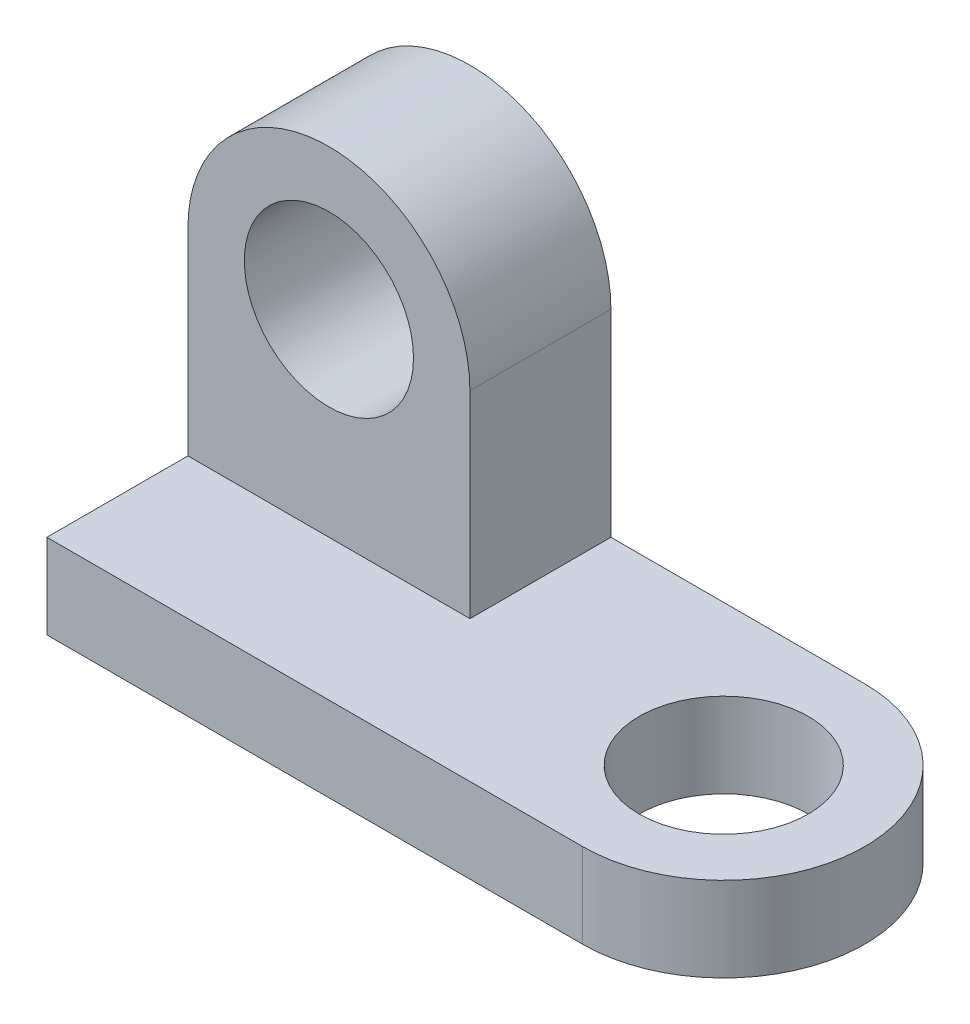
ISO-10303-21;
HEADER;
FILE_DESCRIPTION(('STEP AP214'),'2;1');
FILE_NAME('part.step','',(''),(''),'','','');
FILE_SCHEMA(('AUTOMOTIVE_DESIGN { 1 0 10303 214 1 1 1 1 }'));
ENDSEC;
DATA;
#1=APPLICATION_CONTEXT('core data for automotive mechanical design processes');
#2=APPLICATION_PROTOCOL_DEFINITION('international standard','automotive_design',2000,#1);
#3=PRODUCT_CONTEXT('',#1,'mechanical');
#4=PRODUCT('Part','Part','',(#3));
#5=PRODUCT_RELATED_PRODUCT_CATEGORY('part','',(#4));
#6=PRODUCT_DEFINITION_FORMATION('','',#4);
#7=PRODUCT_DEFINITION_CONTEXT('part definition',#1,'design');
#8=PRODUCT_DEFINITION('design','',#6,#7);
#9=PRODUCT_DEFINITION_SHAPE('','',#8);
#10=(LENGTH_UNIT() NAMED_UNIT(*) SI_UNIT(.MILLI.,.METRE.));
#11=(NAMED_UNIT(*) PLANE_ANGLE_UNIT() SI_UNIT($,.RADIAN.));
#12=(NAMED_UNIT(*) SI_UNIT($,.STERADIAN.) SOLID_ANGLE_UNIT());
#13=UNCERTAINTY_MEASURE_WITH_UNIT(LENGTH_MEASURE(1.E-05),#10,'distance_accuracy_value','');
#14=(GEOMETRIC_REPRESENTATION_CONTEXT(3) GLOBAL_UNCERTAINTY_ASSIGNED_CONTEXT((#13)) GLOBAL_UNIT_ASSIGNED_CONTEXT((#10,
#11,#12)) REPRESENTATION_CONTEXT('',''));
#15=CARTESIAN_POINT('',(0.,0.,0.));
#16=DIRECTION('',(0.,0.,1.));
#17=DIRECTION('',(1.,0.,0.));
#18=AXIS2_PLACEMENT_3D('',#15,#16,#17);
#19=CARTESIAN_POINT('',(35.,0.,0.));
#20=DIRECTION('',(0.,-1.,0.));
#21=DIRECTION('',(0.,0.,-1.));
#22=AXIS2_PLACEMENT_3D('',#19,#20,#21);
#23=CYLINDRICAL_SURFACE('',#22,25.);
#24=DIRECTION('',(0.,-1.,0.));
#25=VECTOR('',#24,1.);
#26=CARTESIAN_POINT('',(35.,15.,25.));
#27=LINE('',#26,#25);
#28=CARTESIAN_POINT('',(35.,0.,25.));
#29=VERTEX_POINT('',#28);
#30=CARTESIAN_POINT('',(35.,15.,25.));
#31=VERTEX_POINT('',#30);
#32=EDGE_CURVE('E140',#29,#31,#27,.F.);
#33=ORIENTED_EDGE('',*,*,#32,.F.);
#34=CARTESIAN_POINT('',(35.,0.,0.));
#35=DIRECTION('',(0.,1.,0.));
#36=DIRECTION('',(0.,0.,1.));
#37=AXIS2_PLACEMENT_3D('',#34,#35,#36);
#38=CIRCLE('',#37,25.);
#39=CARTESIAN_POINT('',(35.,0.,-25.));
#40=VERTEX_POINT('',#39);
#41=EDGE_CURVE('E40',#40,#29,#38,.F.);
#42=ORIENTED_EDGE('',*,*,#41,.F.);
#43=DIRECTION('',(0.,-1.,0.));
#44=VECTOR('',#43,1.);
#45=CARTESIAN_POINT('',(35.,15.,-25.));
#46=LINE('',#45,#44);
#47=CARTESIAN_POINT('',(35.,15.,-25.));
#48=VERTEX_POINT('',#47);
#49=EDGE_CURVE('E143',#48,#40,#46,.T.);
#50=ORIENTED_EDGE('',*,*,#49,.F.);
#51=CARTESIAN_POINT('',(35.,15.,0.));
#52=DIRECTION('',(0.,1.,0.));
#53=DIRECTION('',(0.,0.,1.));
#54=AXIS2_PLACEMENT_3D('',#51,#52,#53);
#55=CIRCLE('',#54,25.);
#56=EDGE_CURVE('E11',#31,#48,#55,.T.);
#57=ORIENTED_EDGE('',*,*,#56,.F.);
#58=EDGE_LOOP('',(#33,#42,#50,#57));
#59=FACE_BOUND('',#58,.T.);
#60=ADVANCED_FACE('F33',(#59),#23,.T.);
#61=CARTESIAN_POINT('',(-35.,50.,0.));
#62=DIRECTION('',(0.,0.,1.));
#63=DIRECTION('',(1.,0.,0.));
#64=AXIS2_PLACEMENT_3D('',#61,#62,#63);
#65=CYLINDRICAL_SURFACE('',#64,25.);
#66=DIRECTION('',(0.,0.,-1.));
#67=VECTOR('',#66,1.);
#68=CARTESIAN_POINT('',(-60.,50.,0.));
#69=LINE('',#68,#67);
#70=CARTESIAN_POINT('',(-60.,50.,0.));
#71=VERTEX_POINT('',#70);
#72=CARTESIAN_POINT('',(-60.,50.,-25.));
#73=VERTEX_POINT('',#72);
#74=EDGE_CURVE('E130',#71,#73,#69,.T.);
#75=ORIENTED_EDGE('',*,*,#74,.F.);
#76=CARTESIAN_POINT('',(-35.,50.,0.));
#77=DIRECTION('',(0.,0.,-1.));
#78=DIRECTION('',(-1.,0.,0.));
#79=AXIS2_PLACEMENT_3D('',#76,#77,#78);
#80=CIRCLE('',#79,25.);
#81=CARTESIAN_POINT('',(-9.99999999999999,50.,0.));
#82=VERTEX_POINT('',#81);
#83=EDGE_CURVE('E136',#82,#71,#80,.F.);
#84=ORIENTED_EDGE('',*,*,#83,.F.);
#85=DIRECTION('',(0.,0.,-1.));
#86=VECTOR('',#85,1.);
#87=CARTESIAN_POINT('',(-9.99999999999999,50.,0.));
#88=LINE('',#87,#86);
#89=CARTESIAN_POINT('',(-9.99999999999999,50.,-25.));
#90=VERTEX_POINT('',#89);
#91=EDGE_CURVE('E95',#90,#82,#88,.F.);
#92=ORIENTED_EDGE('',*,*,#91,.F.);
#93=CARTESIAN_POINT('',(-35.,50.,-25.));
#94=DIRECTION('',(0.,0.,1.));
#95=DIRECTION('',(1.,0.,0.));
#96=AXIS2_PLACEMENT_3D('',#93,#94,#95);
#97=CIRCLE('',#96,25.);
#98=EDGE_CURVE('E138',#73,#90,#97,.F.);
#99=ORIENTED_EDGE('',*,*,#98,.F.);
#100=EDGE_LOOP('',(#75,#84,#92,#99));
#101=FACE_BOUND('',#100,.T.);
#102=ADVANCED_FACE('F176',(#101),#65,.T.);
#103=CARTESIAN_POINT('',(-60.,15.,-25.));
#104=DIRECTION('',(0.,0.,1.));
#105=DIRECTION('',(1.,0.,0.));
#106=AXIS2_PLACEMENT_3D('',#103,#104,#105);
#107=PLANE('',#106);
#108=CARTESIAN_POINT('',(-35.,50.,-25.));
#109=DIRECTION('',(0.,0.,1.));
#110=DIRECTION('',(1.,0.,0.));
#111=AXIS2_PLACEMENT_3D('',#108,#109,#110);
#112=CIRCLE('',#111,15.);
#113=CARTESIAN_POINT('',(-20.,50.,-25.));
#114=VERTEX_POINT('',#113);
#115=EDGE_CURVE('E215',#114,#114,#112,.T.);
#116=ORIENTED_EDGE('',*,*,#115,.T.);
#117=EDGE_LOOP('',(#116));
#118=FACE_BOUND('',#117,.T.);
#119=DIRECTION('',(-1.,0.,0.));
#120=VECTOR('',#119,1.);
#121=CARTESIAN_POINT('',(-60.,15.,-25.));
#122=LINE('',#121,#120);
#123=CARTESIAN_POINT('',(-9.99999999999999,15.,-25.));
#124=VERTEX_POINT('',#123);
#125=EDGE_CURVE('E106',#48,#124,#122,.T.);
#126=ORIENTED_EDGE('',*,*,#125,.F.);
#127=ORIENTED_EDGE('',*,*,#49,.T.);
#128=DIRECTION('',(-1.,0.,0.));
#129=VECTOR('',#128,1.);
#130=CARTESIAN_POINT('',(-60.,0.,-25.));
#131=LINE('',#130,#129);
#132=CARTESIAN_POINT('',(-60.,0.,-25.));
#133=VERTEX_POINT('',#132);
#134=EDGE_CURVE('E128',#40,#133,#131,.T.);
#135=ORIENTED_EDGE('',*,*,#134,.T.);
#136=DIRECTION('',(0.,-1.,0.));
#137=VECTOR('',#136,1.);
#138=CARTESIAN_POINT('',(-60.,15.,-25.));
#139=LINE('',#138,#137);
#140=EDGE_CURVE('E133',#73,#133,#139,.T.);
#141=ORIENTED_EDGE('',*,*,#140,.F.);
#142=ORIENTED_EDGE('',*,*,#98,.T.);
#143=DIRECTION('',(0.,-1.,0.));
#144=VECTOR('',#143,1.);
#145=CARTESIAN_POINT('',(-9.99999999999999,75.,-25.));
#146=LINE('',#145,#144);
#147=EDGE_CURVE('E99',#90,#124,#146,.T.);
#148=ORIENTED_EDGE('',*,*,#147,.T.);
#149=EDGE_LOOP('',(#126,#127,#135,#141,#142,#148));
#150=FACE_BOUND('',#149,.T.);
#151=ADVANCED_FACE('F174',(#118,#150),#107,.F.);
#152=CARTESIAN_POINT('',(-60.,15.,-25.));
#153=DIRECTION('',(1.,0.,0.));
#154=DIRECTION('',(0.,0.,-1.));
#155=AXIS2_PLACEMENT_3D('',#152,#153,#154);
#156=PLANE('',#155);
#157=DIRECTION('',(0.,-1.,0.));
#158=VECTOR('',#157,1.);
#159=CARTESIAN_POINT('',(-60.,75.,0.));
#160=LINE('',#159,#158);
#161=CARTESIAN_POINT('',(-60.,15.,0.));
#162=VERTEX_POINT('',#161);
#163=EDGE_CURVE('E98',#71,#162,#160,.T.);
#164=ORIENTED_EDGE('',*,*,#163,.F.);
#165=ORIENTED_EDGE('',*,*,#74,.T.);
#166=ORIENTED_EDGE('',*,*,#140,.T.);
#167=DIRECTION('',(0.,0.,1.));
#168=VECTOR('',#167,1.);
#169=CARTESIAN_POINT('',(-60.,0.,-25.));
#170=LINE('',#169,#168);
#171=CARTESIAN_POINT('',(-60.,0.,25.));
#172=VERTEX_POINT('',#171);
#173=EDGE_CURVE('E154',#133,#172,#170,.T.);
#174=ORIENTED_EDGE('',*,*,#173,.T.);
#175=DIRECTION('',(0.,-1.,0.));
#176=VECTOR('',#175,1.);
#177=CARTESIAN_POINT('',(-60.,15.,25.));
#178=LINE('',#177,#176);
#179=CARTESIAN_POINT('',(-60.,15.,25.));
#180=VERTEX_POINT('',#179);
#181=EDGE_CURVE('E152',#180,#172,#178,.T.);
#182=ORIENTED_EDGE('',*,*,#181,.F.);
#183=DIRECTION('',(0.,0.,1.));
#184=VECTOR('',#183,1.);
#185=CARTESIAN_POINT('',(-60.,15.,-25.));
#186=LINE('',#185,#184);
#187=EDGE_CURVE('E118',#162,#180,#186,.T.);
#188=ORIENTED_EDGE('',*,*,#187,.F.);
#189=EDGE_LOOP('',(#164,#165,#166,#174,#182,#188));
#190=FACE_BOUND('',#189,.T.);
#191=ADVANCED_FACE('F163',(#190),#156,.F.);
#192=CARTESIAN_POINT('',(-60.,15.,25.));
#193=DIRECTION('',(0.,0.,-1.));
#194=DIRECTION('',(-1.,0.,0.));
#195=AXIS2_PLACEMENT_3D('',#192,#193,#194);
#196=PLANE('',#195);
#197=DIRECTION('',(1.,0.,0.));
#198=VECTOR('',#197,1.);
#199=CARTESIAN_POINT('',(-60.,0.,25.));
#200=LINE('',#199,#198);
#201=EDGE_CURVE('E146',#172,#29,#200,.T.);
#202=ORIENTED_EDGE('',*,*,#201,.T.);
#203=ORIENTED_EDGE('',*,*,#32,.T.);
#204=DIRECTION('',(1.,0.,0.));
#205=VECTOR('',#204,1.);
#206=CARTESIAN_POINT('',(-60.,15.,25.));
#207=LINE('',#206,#205);
#208=EDGE_CURVE('E150',#180,#31,#207,.T.);
#209=ORIENTED_EDGE('',*,*,#208,.F.);
#210=ORIENTED_EDGE('',*,*,#181,.T.);
#211=EDGE_LOOP('',(#202,#203,#209,#210));
#212=FACE_BOUND('',#211,.T.);
#213=ADVANCED_FACE('F172',(#212),#196,.F.);
#214=CARTESIAN_POINT('',(0.,15.,0.));
#215=DIRECTION('',(0.,1.,0.));
#216=DIRECTION('',(0.,0.,1.));
#217=AXIS2_PLACEMENT_3D('',#214,#215,#216);
#218=PLANE('',#217);
#219=CARTESIAN_POINT('',(35.,15.,0.));
#220=DIRECTION('',(0.,1.,0.));
#221=DIRECTION('',(0.,0.,1.));
#222=AXIS2_PLACEMENT_3D('',#219,#220,#221);
#223=CIRCLE('',#222,15.);
#224=CARTESIAN_POINT('',(35.,15.,15.));
#225=VERTEX_POINT('',#224);
#226=EDGE_CURVE('E114',#225,#225,#223,.T.);
#227=ORIENTED_EDGE('',*,*,#226,.F.);
#228=EDGE_LOOP('',(#227));
#229=FACE_BOUND('',#228,.T.);
#230=ORIENTED_EDGE('',*,*,#208,.T.);
#231=ORIENTED_EDGE('',*,*,#56,.T.);
#232=ORIENTED_EDGE('',*,*,#125,.T.);
#233=DIRECTION('',(0.,0.,-1.));
#234=VECTOR('',#233,1.);
#235=CARTESIAN_POINT('',(-9.99999999999999,15.,-25.));
#236=LINE('',#235,#234);
#237=CARTESIAN_POINT('',(-9.99999999999999,15.,0.));
#238=VERTEX_POINT('',#237);
#239=EDGE_CURVE('E93',#238,#124,#236,.T.);
#240=ORIENTED_EDGE('',*,*,#239,.F.);
#241=DIRECTION('',(1.,0.,0.));
#242=VECTOR('',#241,1.);
#243=CARTESIAN_POINT('',(-60.,15.,0.));
#244=LINE('',#243,#242);
#245=EDGE_CURVE('E103',#162,#238,#244,.T.);
#246=ORIENTED_EDGE('',*,*,#245,.F.);
#247=ORIENTED_EDGE('',*,*,#187,.T.);
#248=EDGE_LOOP('',(#230,#231,#232,#240,#246,#247));
#249=FACE_BOUND('',#248,.T.);
#250=ADVANCED_FACE('F102',(#229,#249),#218,.T.);
#251=CARTESIAN_POINT('',(0.,0.,0.));
#252=DIRECTION('',(0.,1.,0.));
#253=DIRECTION('',(0.,0.,1.));
#254=AXIS2_PLACEMENT_3D('',#251,#252,#253);
#255=PLANE('',#254);
#256=CARTESIAN_POINT('',(35.,0.,0.));
#257=DIRECTION('',(0.,1.,0.));
#258=DIRECTION('',(0.,0.,1.));
#259=AXIS2_PLACEMENT_3D('',#256,#257,#258);
#260=CIRCLE('',#259,15.);
#261=CARTESIAN_POINT('',(35.,0.,15.));
#262=VERTEX_POINT('',#261);
#263=EDGE_CURVE('E111',#262,#262,#260,.T.);
#264=ORIENTED_EDGE('',*,*,#263,.T.);
#265=EDGE_LOOP('',(#264));
#266=FACE_BOUND('',#265,.T.);
#267=ORIENTED_EDGE('',*,*,#134,.F.);
#268=ORIENTED_EDGE('',*,*,#41,.T.);
#269=ORIENTED_EDGE('',*,*,#201,.F.);
#270=ORIENTED_EDGE('',*,*,#173,.F.);
#271=EDGE_LOOP('',(#267,#268,#269,#270));
#272=FACE_BOUND('',#271,.T.);
#273=ADVANCED_FACE('F170',(#266,#272),#255,.F.);
#274=CARTESIAN_POINT('',(-60.,75.,0.));
#275=DIRECTION('',(0.,0.,-1.));
#276=DIRECTION('',(-1.,0.,0.));
#277=AXIS2_PLACEMENT_3D('',#274,#275,#276);
#278=PLANE('',#277);
#279=CARTESIAN_POINT('',(-35.,50.,0.));
#280=DIRECTION('',(0.,0.,1.));
#281=DIRECTION('',(1.,0.,0.));
#282=AXIS2_PLACEMENT_3D('',#279,#280,#281);
#283=CIRCLE('',#282,15.);
#284=CARTESIAN_POINT('',(-20.,50.,0.));
#285=VERTEX_POINT('',#284);
#286=EDGE_CURVE('E212',#285,#285,#283,.T.);
#287=ORIENTED_EDGE('',*,*,#286,.F.);
#288=EDGE_LOOP('',(#287));
#289=FACE_BOUND('',#288,.T.);
#290=DIRECTION('',(0.,-1.,0.));
#291=VECTOR('',#290,1.);
#292=CARTESIAN_POINT('',(-9.99999999999999,75.,0.));
#293=LINE('',#292,#291);
#294=EDGE_CURVE('E89',#82,#238,#293,.T.);
#295=ORIENTED_EDGE('',*,*,#294,.F.);
#296=ORIENTED_EDGE('',*,*,#83,.T.);
#297=ORIENTED_EDGE('',*,*,#163,.T.);
#298=ORIENTED_EDGE('',*,*,#245,.T.);
#299=EDGE_LOOP('',(#295,#296,#297,#298));
#300=FACE_BOUND('',#299,.T.);
#301=ADVANCED_FACE('F109',(#289,#300),#278,.F.);
#302=CARTESIAN_POINT('',(-9.99999999999999,75.,-25.));
#303=DIRECTION('',(-1.,0.,0.));
#304=DIRECTION('',(0.,0.,1.));
#305=AXIS2_PLACEMENT_3D('',#302,#303,#304);
#306=PLANE('',#305);
#307=ORIENTED_EDGE('',*,*,#147,.F.);
#308=ORIENTED_EDGE('',*,*,#91,.T.);
#309=ORIENTED_EDGE('',*,*,#294,.T.);
#310=ORIENTED_EDGE('',*,*,#239,.T.);
#311=EDGE_LOOP('',(#307,#308,#309,#310));
#312=FACE_BOUND('',#311,.T.);
#313=ADVANCED_FACE('F92',(#312),#306,.F.);
#314=CARTESIAN_POINT('',(35.,0.,0.));
#315=DIRECTION('',(0.,1.,0.));
#316=DIRECTION('',(0.,0.,1.));
#317=AXIS2_PLACEMENT_3D('',#314,#315,#316);
#318=CYLINDRICAL_SURFACE('',#317,15.);
#319=ORIENTED_EDGE('',*,*,#263,.F.);
#320=EDGE_LOOP('',(#319));
#321=FACE_BOUND('',#320,.T.);
#322=ORIENTED_EDGE('',*,*,#226,.T.);
#323=EDGE_LOOP('',(#322));
#324=FACE_BOUND('',#323,.T.);
#325=ADVANCED_FACE('F200',(#321,#324),#318,.F.);
#326=CARTESIAN_POINT('',(-35.,50.,-25.00005));
#327=DIRECTION('',(0.,0.,1.));
#328=DIRECTION('',(1.,0.,0.));
#329=AXIS2_PLACEMENT_3D('',#326,#327,#328);
#330=CYLINDRICAL_SURFACE('',#329,15.);
#331=ORIENTED_EDGE('',*,*,#286,.T.);
#332=EDGE_LOOP('',(#331));
#333=FACE_BOUND('',#332,.T.);
#334=ORIENTED_EDGE('',*,*,#115,.F.);
#335=EDGE_LOOP('',(#334));
#336=FACE_BOUND('',#335,.T.);
#337=ADVANCED_FACE('F203',(#333,#336),#330,.F.);
#338=CLOSED_SHELL('',(#60,#102,#151,#191,#213,#250,#273,#301,#313,#325,#337));
#339=MANIFOLD_SOLID_BREP('B2',#338);
#340=ADVANCED_BREP_SHAPE_REPRESENTATION('',(#18,#339),#14);
#341=SHAPE_DEFINITION_REPRESENTATION(#9,#340);
ENDSEC;
END-ISO-10303-21;
